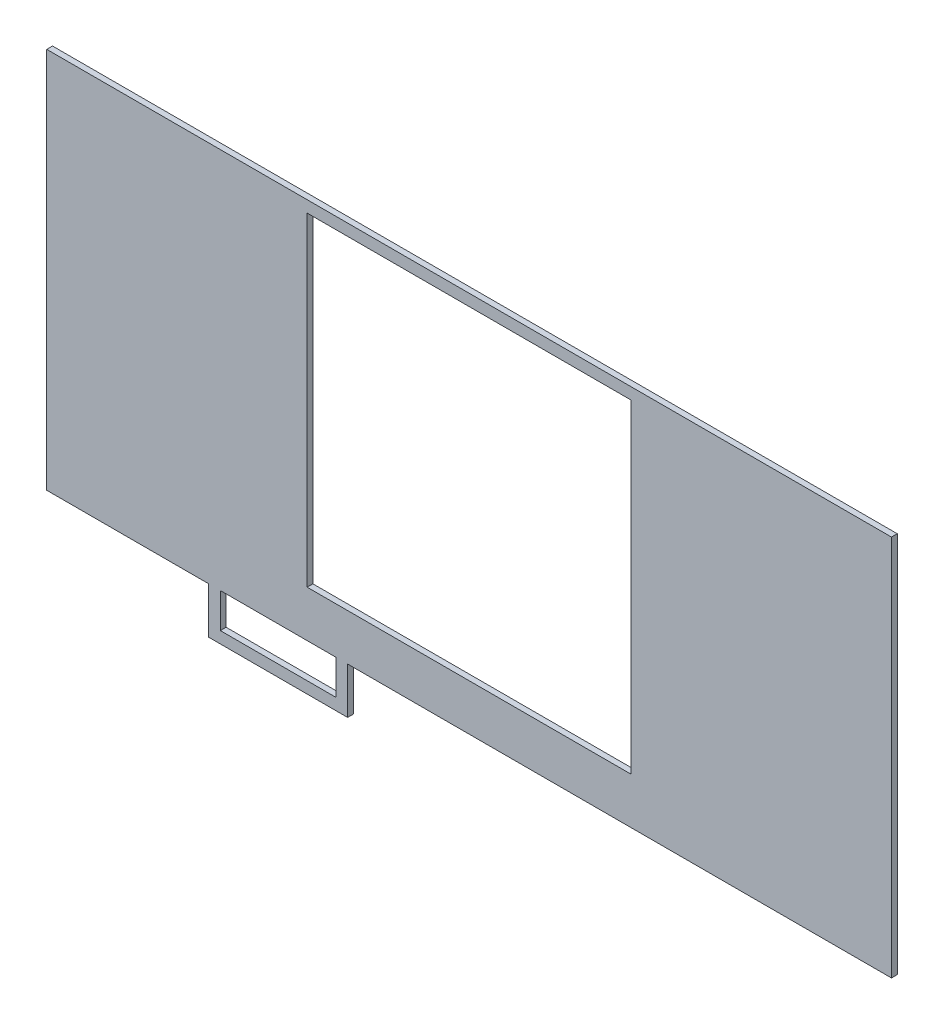
ISO-10303-21;
HEADER;
FILE_DESCRIPTION(('STEP AP214'),'2;1');
FILE_NAME('part.step','',(''),(''),'','','');
FILE_SCHEMA(('AUTOMOTIVE_DESIGN { 1 0 10303 214 1 1 1 1 }'));
ENDSEC;
DATA;
#1=APPLICATION_CONTEXT('core data for automotive mechanical design processes');
#2=APPLICATION_PROTOCOL_DEFINITION('international standard','automotive_design',2000,#1);
#3=PRODUCT_CONTEXT('',#1,'mechanical');
#4=PRODUCT('Part','Part','',(#3));
#5=PRODUCT_RELATED_PRODUCT_CATEGORY('part','',(#4));
#6=PRODUCT_DEFINITION_FORMATION('','',#4);
#7=PRODUCT_DEFINITION_CONTEXT('part definition',#1,'design');
#8=PRODUCT_DEFINITION('design','',#6,#7);
#9=PRODUCT_DEFINITION_SHAPE('','',#8);
#10=(LENGTH_UNIT() NAMED_UNIT(*) SI_UNIT(.MILLI.,.METRE.));
#11=(NAMED_UNIT(*) PLANE_ANGLE_UNIT() SI_UNIT($,.RADIAN.));
#12=(NAMED_UNIT(*) SI_UNIT($,.STERADIAN.) SOLID_ANGLE_UNIT());
#13=UNCERTAINTY_MEASURE_WITH_UNIT(LENGTH_MEASURE(1.E-05),#10,'distance_accuracy_value','');
#14=(GEOMETRIC_REPRESENTATION_CONTEXT(3) GLOBAL_UNCERTAINTY_ASSIGNED_CONTEXT((#13)) GLOBAL_UNIT_ASSIGNED_CONTEXT((#10,
#11,#12)) REPRESENTATION_CONTEXT('',''));
#15=CARTESIAN_POINT('',(0.,0.,0.));
#16=DIRECTION('',(0.,0.,1.));
#17=DIRECTION('',(1.,0.,0.));
#18=AXIS2_PLACEMENT_3D('',#15,#16,#17);
#19=CARTESIAN_POINT('',(-365.,-165.,5.));
#20=DIRECTION('',(0.,1.,0.));
#21=DIRECTION('',(0.,0.,1.));
#22=AXIS2_PLACEMENT_3D('',#19,#20,#21);
#23=PLANE('',#22);
#24=DIRECTION('',(1.,0.,0.));
#25=VECTOR('',#24,1.);
#26=CARTESIAN_POINT('',(-365.,-165.,0.));
#27=LINE('',#26,#25);
#28=CARTESIAN_POINT('',(-215.,-165.,0.));
#29=VERTEX_POINT('',#28);
#30=CARTESIAN_POINT('',(-115.,-165.,0.));
#31=VERTEX_POINT('',#30);
#32=EDGE_CURVE('E258',#29,#31,#27,.T.);
#33=ORIENTED_EDGE('',*,*,#32,.T.);
#34=DIRECTION('',(0.,0.,1.));
#35=VECTOR('',#34,1.);
#36=CARTESIAN_POINT('',(-115.,-165.,-126.491106406735));
#37=LINE('',#36,#35);
#38=CARTESIAN_POINT('',(-115.,-165.,5.));
#39=VERTEX_POINT('',#38);
#40=EDGE_CURVE('E58',#31,#39,#37,.T.);
#41=ORIENTED_EDGE('',*,*,#40,.T.);
#42=DIRECTION('',(1.,0.,0.));
#43=VECTOR('',#42,1.);
#44=CARTESIAN_POINT('',(-365.,-165.,5.));
#45=LINE('',#44,#43);
#46=CARTESIAN_POINT('',(-215.,-165.,5.));
#47=VERTEX_POINT('',#46);
#48=EDGE_CURVE('E249',#47,#39,#45,.T.);
#49=ORIENTED_EDGE('',*,*,#48,.F.);
#50=DIRECTION('',(0.,0.,1.));
#51=VECTOR('',#50,1.);
#52=CARTESIAN_POINT('',(-215.,-165.,-126.491106406735));
#53=LINE('',#52,#51);
#54=EDGE_CURVE('E199',#29,#47,#53,.T.);
#55=ORIENTED_EDGE('',*,*,#54,.F.);
#56=EDGE_LOOP('',(#33,#41,#49,#55));
#57=FACE_BOUND('',#56,.T.);
#58=ADVANCED_FACE('F35',(#57),#23,.F.);
#59=DIRECTION('',(0.,0.,1.));
#60=VECTOR('',#59,1.);
#61=CARTESIAN_POINT('',(-105.,-165.,-126.491106406735));
#62=LINE('',#61,#60);
#63=CARTESIAN_POINT('',(-105.,-165.,0.));
#64=VERTEX_POINT('',#63);
#65=CARTESIAN_POINT('',(-105.,-165.,5.));
#66=VERTEX_POINT('',#65);
#67=EDGE_CURVE('E192',#64,#66,#62,.T.);
#68=ORIENTED_EDGE('',*,*,#67,.F.);
#69=CARTESIAN_POINT('',(365.,-165.,0.));
#70=VERTEX_POINT('',#69);
#71=EDGE_CURVE('E256',#64,#70,#27,.T.);
#72=ORIENTED_EDGE('',*,*,#71,.T.);
#73=DIRECTION('',(0.,0.,-1.));
#74=VECTOR('',#73,1.);
#75=CARTESIAN_POINT('',(365.,-165.,5.));
#76=LINE('',#75,#74);
#77=CARTESIAN_POINT('',(365.,-165.,5.));
#78=VERTEX_POINT('',#77);
#79=EDGE_CURVE('E248',#78,#70,#76,.T.);
#80=ORIENTED_EDGE('',*,*,#79,.F.);
#81=EDGE_CURVE('E50',#66,#78,#45,.T.);
#82=ORIENTED_EDGE('',*,*,#81,.F.);
#83=EDGE_LOOP('',(#68,#72,#80,#82));
#84=FACE_BOUND('',#83,.T.);
#85=ADVANCED_FACE('F301',(#84),#23,.F.);
#86=CARTESIAN_POINT('',(365.,-165.,5.));
#87=DIRECTION('',(-1.,0.,0.));
#88=DIRECTION('',(0.,0.,1.));
#89=AXIS2_PLACEMENT_3D('',#86,#87,#88);
#90=PLANE('',#89);
#91=DIRECTION('',(0.,1.,0.));
#92=VECTOR('',#91,1.);
#93=CARTESIAN_POINT('',(365.,-165.,0.));
#94=LINE('',#93,#92);
#95=CARTESIAN_POINT('',(365.,165.,0.));
#96=VERTEX_POINT('',#95);
#97=EDGE_CURVE('E236',#70,#96,#94,.T.);
#98=ORIENTED_EDGE('',*,*,#97,.T.);
#99=DIRECTION('',(0.,0.,-1.));
#100=VECTOR('',#99,1.);
#101=CARTESIAN_POINT('',(365.,165.,5.));
#102=LINE('',#101,#100);
#103=CARTESIAN_POINT('',(365.,165.,5.));
#104=VERTEX_POINT('',#103);
#105=EDGE_CURVE('E11',#104,#96,#102,.T.);
#106=ORIENTED_EDGE('',*,*,#105,.F.);
#107=DIRECTION('',(0.,1.,0.));
#108=VECTOR('',#107,1.);
#109=CARTESIAN_POINT('',(365.,-165.,5.));
#110=LINE('',#109,#108);
#111=EDGE_CURVE('E237',#78,#104,#110,.T.);
#112=ORIENTED_EDGE('',*,*,#111,.F.);
#113=ORIENTED_EDGE('',*,*,#79,.T.);
#114=EDGE_LOOP('',(#98,#106,#112,#113));
#115=FACE_BOUND('',#114,.T.);
#116=ADVANCED_FACE('F37',(#115),#90,.F.);
#117=CARTESIAN_POINT('',(-365.,165.,5.));
#118=DIRECTION('',(0.,-1.,0.));
#119=DIRECTION('',(0.,0.,-1.));
#120=AXIS2_PLACEMENT_3D('',#117,#118,#119);
#121=PLANE('',#120);
#122=DIRECTION('',(-1.,0.,0.));
#123=VECTOR('',#122,1.);
#124=CARTESIAN_POINT('',(-365.,165.,0.));
#125=LINE('',#124,#123);
#126=CARTESIAN_POINT('',(-365.,165.,0.));
#127=VERTEX_POINT('',#126);
#128=EDGE_CURVE('E252',#96,#127,#125,.T.);
#129=ORIENTED_EDGE('',*,*,#128,.T.);
#130=DIRECTION('',(0.,0.,-1.));
#131=VECTOR('',#130,1.);
#132=CARTESIAN_POINT('',(-365.,165.,5.));
#133=LINE('',#132,#131);
#134=CARTESIAN_POINT('',(-365.,165.,5.));
#135=VERTEX_POINT('',#134);
#136=EDGE_CURVE('E43',#135,#127,#133,.T.);
#137=ORIENTED_EDGE('',*,*,#136,.F.);
#138=DIRECTION('',(-1.,0.,0.));
#139=VECTOR('',#138,1.);
#140=CARTESIAN_POINT('',(-365.,165.,5.));
#141=LINE('',#140,#139);
#142=EDGE_CURVE('E240',#104,#135,#141,.T.);
#143=ORIENTED_EDGE('',*,*,#142,.F.);
#144=ORIENTED_EDGE('',*,*,#105,.T.);
#145=EDGE_LOOP('',(#129,#137,#143,#144));
#146=FACE_BOUND('',#145,.T.);
#147=ADVANCED_FACE('F303',(#146),#121,.F.);
#148=CARTESIAN_POINT('',(-365.,-165.,5.));
#149=DIRECTION('',(1.,0.,0.));
#150=DIRECTION('',(0.,0.,-1.));
#151=AXIS2_PLACEMENT_3D('',#148,#149,#150);
#152=PLANE('',#151);
#153=DIRECTION('',(0.,-1.,0.));
#154=VECTOR('',#153,1.);
#155=CARTESIAN_POINT('',(-365.,-165.,0.));
#156=LINE('',#155,#154);
#157=CARTESIAN_POINT('',(-365.,-165.,0.));
#158=VERTEX_POINT('',#157);
#159=EDGE_CURVE('E254',#127,#158,#156,.T.);
#160=ORIENTED_EDGE('',*,*,#159,.T.);
#161=DIRECTION('',(0.,0.,-1.));
#162=VECTOR('',#161,1.);
#163=CARTESIAN_POINT('',(-365.,-165.,5.));
#164=LINE('',#163,#162);
#165=CARTESIAN_POINT('',(-365.,-165.,5.));
#166=VERTEX_POINT('',#165);
#167=EDGE_CURVE('E261',#166,#158,#164,.T.);
#168=ORIENTED_EDGE('',*,*,#167,.F.);
#169=DIRECTION('',(0.,-1.,0.));
#170=VECTOR('',#169,1.);
#171=CARTESIAN_POINT('',(-365.,-165.,5.));
#172=LINE('',#171,#170);
#173=EDGE_CURVE('E243',#135,#166,#172,.T.);
#174=ORIENTED_EDGE('',*,*,#173,.F.);
#175=ORIENTED_EDGE('',*,*,#136,.T.);
#176=EDGE_LOOP('',(#160,#168,#174,#175));
#177=FACE_BOUND('',#176,.T.);
#178=ADVANCED_FACE('F268',(#177),#152,.F.);
#179=CARTESIAN_POINT('',(-225.,-165.,0.));
#180=VERTEX_POINT('',#179);
#181=EDGE_CURVE('E241',#158,#180,#27,.T.);
#182=ORIENTED_EDGE('',*,*,#181,.T.);
#183=DIRECTION('',(0.,0.,1.));
#184=VECTOR('',#183,1.);
#185=CARTESIAN_POINT('',(-225.,-165.,-126.491106406735));
#186=LINE('',#185,#184);
#187=CARTESIAN_POINT('',(-225.,-165.,5.));
#188=VERTEX_POINT('',#187);
#189=EDGE_CURVE('E190',#180,#188,#186,.T.);
#190=ORIENTED_EDGE('',*,*,#189,.T.);
#191=EDGE_CURVE('E245',#166,#188,#45,.T.);
#192=ORIENTED_EDGE('',*,*,#191,.F.);
#193=ORIENTED_EDGE('',*,*,#167,.T.);
#194=EDGE_LOOP('',(#182,#190,#192,#193));
#195=FACE_BOUND('',#194,.T.);
#196=ADVANCED_FACE('F277',(#195),#23,.F.);
#197=CARTESIAN_POINT('',(0.,0.,5.));
#198=DIRECTION('',(0.,0.,-1.));
#199=DIRECTION('',(-1.,0.,0.));
#200=AXIS2_PLACEMENT_3D('',#197,#198,#199);
#201=PLANE('',#200);
#202=DIRECTION('',(0.,-1.,0.));
#203=VECTOR('',#202,1.);
#204=CARTESIAN_POINT('',(-215.,-1.98914958578674E-13,5.));
#205=LINE('',#204,#203);
#206=CARTESIAN_POINT('',(-215.,-195.,5.));
#207=VERTEX_POINT('',#206);
#208=EDGE_CURVE('E198',#47,#207,#205,.T.);
#209=ORIENTED_EDGE('',*,*,#208,.F.);
#210=ORIENTED_EDGE('',*,*,#48,.T.);
#211=DIRECTION('',(0.,-1.,0.));
#212=VECTOR('',#211,1.);
#213=CARTESIAN_POINT('',(-115.,-1.06396373193244E-13,5.));
#214=LINE('',#213,#212);
#215=CARTESIAN_POINT('',(-115.,-195.,5.));
#216=VERTEX_POINT('',#215);
#217=EDGE_CURVE('E159',#39,#216,#214,.T.);
#218=ORIENTED_EDGE('',*,*,#217,.T.);
#219=DIRECTION('',(1.,0.,0.));
#220=VECTOR('',#219,1.);
#221=CARTESIAN_POINT('',(0.,-195.,5.));
#222=LINE('',#221,#220);
#223=EDGE_CURVE('E165',#207,#216,#222,.T.);
#224=ORIENTED_EDGE('',*,*,#223,.F.);
#225=EDGE_LOOP('',(#209,#210,#218,#224));
#226=FACE_BOUND('',#225,.T.);
#227=DIRECTION('',(0.,-1.,0.));
#228=VECTOR('',#227,1.);
#229=CARTESIAN_POINT('',(-140.,155.,5.));
#230=LINE('',#229,#228);
#231=CARTESIAN_POINT('',(-140.,155.,5.));
#232=VERTEX_POINT('',#231);
#233=CARTESIAN_POINT('',(-140.,-125.,5.));
#234=VERTEX_POINT('',#233);
#235=EDGE_CURVE('E208',#232,#234,#230,.T.);
#236=ORIENTED_EDGE('',*,*,#235,.F.);
#237=DIRECTION('',(-1.,0.,0.));
#238=VECTOR('',#237,1.);
#239=CARTESIAN_POINT('',(140.,155.,5.));
#240=LINE('',#239,#238);
#241=CARTESIAN_POINT('',(140.,155.,5.));
#242=VERTEX_POINT('',#241);
#243=EDGE_CURVE('E211',#242,#232,#240,.T.);
#244=ORIENTED_EDGE('',*,*,#243,.F.);
#245=DIRECTION('',(0.,1.,0.));
#246=VECTOR('',#245,1.);
#247=CARTESIAN_POINT('',(140.,155.,5.));
#248=LINE('',#247,#246);
#249=CARTESIAN_POINT('',(140.,-125.,5.));
#250=VERTEX_POINT('',#249);
#251=EDGE_CURVE('E204',#250,#242,#248,.T.);
#252=ORIENTED_EDGE('',*,*,#251,.F.);
#253=DIRECTION('',(1.,0.,0.));
#254=VECTOR('',#253,1.);
#255=CARTESIAN_POINT('',(140.,-125.,5.));
#256=LINE('',#255,#254);
#257=EDGE_CURVE('E205',#234,#250,#256,.T.);
#258=ORIENTED_EDGE('',*,*,#257,.F.);
#259=EDGE_LOOP('',(#236,#244,#252,#258));
#260=FACE_BOUND('',#259,.T.);
#261=ORIENTED_EDGE('',*,*,#111,.T.);
#262=ORIENTED_EDGE('',*,*,#142,.T.);
#263=ORIENTED_EDGE('',*,*,#173,.T.);
#264=ORIENTED_EDGE('',*,*,#191,.T.);
#265=DIRECTION('',(0.,-1.,0.));
#266=VECTOR('',#265,1.);
#267=CARTESIAN_POINT('',(-225.,-1.56125112837913E-13,5.));
#268=LINE('',#267,#266);
#269=CARTESIAN_POINT('',(-225.,-205.,5.));
#270=VERTEX_POINT('',#269);
#271=EDGE_CURVE('E175',#188,#270,#268,.T.);
#272=ORIENTED_EDGE('',*,*,#271,.T.);
#273=DIRECTION('',(1.,0.,0.));
#274=VECTOR('',#273,1.);
#275=CARTESIAN_POINT('',(0.,-205.,5.));
#276=LINE('',#275,#274);
#277=CARTESIAN_POINT('',(-105.,-205.,5.));
#278=VERTEX_POINT('',#277);
#279=EDGE_CURVE('E172',#270,#278,#276,.T.);
#280=ORIENTED_EDGE('',*,*,#279,.T.);
#281=DIRECTION('',(0.,-1.,0.));
#282=VECTOR('',#281,1.);
#283=CARTESIAN_POINT('',(-105.,0.,5.));
#284=LINE('',#283,#282);
#285=EDGE_CURVE('E194',#66,#278,#284,.T.);
#286=ORIENTED_EDGE('',*,*,#285,.F.);
#287=ORIENTED_EDGE('',*,*,#81,.T.);
#288=EDGE_LOOP('',(#261,#262,#263,#264,#272,#280,#286,#287));
#289=FACE_BOUND('',#288,.T.);
#290=ADVANCED_FACE('F282',(#226,#260,#289),#201,.F.);
#291=CARTESIAN_POINT('',(0.,0.,0.));
#292=DIRECTION('',(0.,0.,-1.));
#293=DIRECTION('',(-1.,0.,0.));
#294=AXIS2_PLACEMENT_3D('',#291,#292,#293);
#295=PLANE('',#294);
#296=ORIENTED_EDGE('',*,*,#32,.F.);
#297=DIRECTION('',(0.,-1.,0.));
#298=VECTOR('',#297,1.);
#299=CARTESIAN_POINT('',(-215.,-1.98914958578674E-13,0.));
#300=LINE('',#299,#298);
#301=CARTESIAN_POINT('',(-215.,-195.,0.));
#302=VERTEX_POINT('',#301);
#303=EDGE_CURVE('E156',#29,#302,#300,.T.);
#304=ORIENTED_EDGE('',*,*,#303,.T.);
#305=DIRECTION('',(1.,0.,0.));
#306=VECTOR('',#305,1.);
#307=CARTESIAN_POINT('',(0.,-195.,0.));
#308=LINE('',#307,#306);
#309=CARTESIAN_POINT('',(-115.,-195.,0.));
#310=VERTEX_POINT('',#309);
#311=EDGE_CURVE('E149',#302,#310,#308,.T.);
#312=ORIENTED_EDGE('',*,*,#311,.T.);
#313=DIRECTION('',(0.,-1.,0.));
#314=VECTOR('',#313,1.);
#315=CARTESIAN_POINT('',(-115.,-1.06396373193244E-13,0.));
#316=LINE('',#315,#314);
#317=EDGE_CURVE('E154',#31,#310,#316,.T.);
#318=ORIENTED_EDGE('',*,*,#317,.F.);
#319=EDGE_LOOP('',(#296,#304,#312,#318));
#320=FACE_BOUND('',#319,.T.);
#321=DIRECTION('',(-1.,0.,0.));
#322=VECTOR('',#321,1.);
#323=CARTESIAN_POINT('',(140.,155.,0.));
#324=LINE('',#323,#322);
#325=CARTESIAN_POINT('',(140.,155.,0.));
#326=VERTEX_POINT('',#325);
#327=CARTESIAN_POINT('',(-140.,155.,0.));
#328=VERTEX_POINT('',#327);
#329=EDGE_CURVE('E207',#326,#328,#324,.T.);
#330=ORIENTED_EDGE('',*,*,#329,.T.);
#331=DIRECTION('',(0.,-1.,0.));
#332=VECTOR('',#331,1.);
#333=CARTESIAN_POINT('',(-140.,155.,0.));
#334=LINE('',#333,#332);
#335=CARTESIAN_POINT('',(-140.,-125.,0.));
#336=VERTEX_POINT('',#335);
#337=EDGE_CURVE('E228',#328,#336,#334,.T.);
#338=ORIENTED_EDGE('',*,*,#337,.T.);
#339=DIRECTION('',(1.,0.,0.));
#340=VECTOR('',#339,1.);
#341=CARTESIAN_POINT('',(140.,-125.,0.));
#342=LINE('',#341,#340);
#343=CARTESIAN_POINT('',(140.,-125.,0.));
#344=VERTEX_POINT('',#343);
#345=EDGE_CURVE('E224',#336,#344,#342,.T.);
#346=ORIENTED_EDGE('',*,*,#345,.T.);
#347=DIRECTION('',(0.,1.,0.));
#348=VECTOR('',#347,1.);
#349=CARTESIAN_POINT('',(140.,155.,0.));
#350=LINE('',#349,#348);
#351=EDGE_CURVE('E219',#344,#326,#350,.T.);
#352=ORIENTED_EDGE('',*,*,#351,.T.);
#353=EDGE_LOOP('',(#330,#338,#346,#352));
#354=FACE_BOUND('',#353,.T.);
#355=ORIENTED_EDGE('',*,*,#97,.F.);
#356=ORIENTED_EDGE('',*,*,#71,.F.);
#357=DIRECTION('',(0.,-1.,0.));
#358=VECTOR('',#357,1.);
#359=CARTESIAN_POINT('',(-105.,0.,0.));
#360=LINE('',#359,#358);
#361=CARTESIAN_POINT('',(-105.,-205.,0.));
#362=VERTEX_POINT('',#361);
#363=EDGE_CURVE('E180',#64,#362,#360,.T.);
#364=ORIENTED_EDGE('',*,*,#363,.T.);
#365=DIRECTION('',(1.,0.,0.));
#366=VECTOR('',#365,1.);
#367=CARTESIAN_POINT('',(0.,-205.,0.));
#368=LINE('',#367,#366);
#369=CARTESIAN_POINT('',(-225.,-205.,0.));
#370=VERTEX_POINT('',#369);
#371=EDGE_CURVE('E182',#370,#362,#368,.T.);
#372=ORIENTED_EDGE('',*,*,#371,.F.);
#373=DIRECTION('',(0.,-1.,0.));
#374=VECTOR('',#373,1.);
#375=CARTESIAN_POINT('',(-225.,-1.56125112837913E-13,0.));
#376=LINE('',#375,#374);
#377=EDGE_CURVE('E187',#180,#370,#376,.T.);
#378=ORIENTED_EDGE('',*,*,#377,.F.);
#379=ORIENTED_EDGE('',*,*,#181,.F.);
#380=ORIENTED_EDGE('',*,*,#159,.F.);
#381=ORIENTED_EDGE('',*,*,#128,.F.);
#382=EDGE_LOOP('',(#355,#356,#364,#372,#378,#379,#380,#381));
#383=FACE_BOUND('',#382,.T.);
#384=ADVANCED_FACE('F151',(#320,#354,#383),#295,.T.);
#385=CARTESIAN_POINT('',(140.,155.,-395.979797464467));
#386=DIRECTION('',(0.,1.,0.));
#387=DIRECTION('',(-1.,0.,0.));
#388=AXIS2_PLACEMENT_3D('',#385,#386,#387);
#389=PLANE('',#388);
#390=DIRECTION('',(0.,0.,1.));
#391=VECTOR('',#390,1.);
#392=CARTESIAN_POINT('',(140.,155.,-395.979797464467));
#393=LINE('',#392,#391);
#394=EDGE_CURVE('E222',#326,#242,#393,.T.);
#395=ORIENTED_EDGE('',*,*,#394,.T.);
#396=ORIENTED_EDGE('',*,*,#243,.T.);
#397=DIRECTION('',(0.,0.,1.));
#398=VECTOR('',#397,1.);
#399=CARTESIAN_POINT('',(-140.,155.,-395.979797464467));
#400=LINE('',#399,#398);
#401=EDGE_CURVE('E218',#328,#232,#400,.T.);
#402=ORIENTED_EDGE('',*,*,#401,.F.);
#403=ORIENTED_EDGE('',*,*,#329,.F.);
#404=EDGE_LOOP('',(#395,#396,#402,#403));
#405=FACE_BOUND('',#404,.T.);
#406=ADVANCED_FACE('F324',(#405),#389,.F.);
#407=CARTESIAN_POINT('',(-140.,155.,-395.979797464467));
#408=DIRECTION('',(-1.,0.,0.));
#409=DIRECTION('',(0.,0.,1.));
#410=AXIS2_PLACEMENT_3D('',#407,#408,#409);
#411=PLANE('',#410);
#412=ORIENTED_EDGE('',*,*,#401,.T.);
#413=ORIENTED_EDGE('',*,*,#235,.T.);
#414=DIRECTION('',(0.,0.,1.));
#415=VECTOR('',#414,1.);
#416=CARTESIAN_POINT('',(-140.,-125.,-395.979797464467));
#417=LINE('',#416,#415);
#418=EDGE_CURVE('E227',#336,#234,#417,.T.);
#419=ORIENTED_EDGE('',*,*,#418,.F.);
#420=ORIENTED_EDGE('',*,*,#337,.F.);
#421=EDGE_LOOP('',(#412,#413,#419,#420));
#422=FACE_BOUND('',#421,.T.);
#423=ADVANCED_FACE('F328',(#422),#411,.F.);
#424=CARTESIAN_POINT('',(140.,-125.,-395.979797464467));
#425=DIRECTION('',(0.,-1.,0.));
#426=DIRECTION('',(1.,0.,0.));
#427=AXIS2_PLACEMENT_3D('',#424,#425,#426);
#428=PLANE('',#427);
#429=ORIENTED_EDGE('',*,*,#418,.T.);
#430=ORIENTED_EDGE('',*,*,#257,.T.);
#431=DIRECTION('',(0.,0.,1.));
#432=VECTOR('',#431,1.);
#433=CARTESIAN_POINT('',(140.,-125.,-395.979797464467));
#434=LINE('',#433,#432);
#435=EDGE_CURVE('E223',#344,#250,#434,.T.);
#436=ORIENTED_EDGE('',*,*,#435,.F.);
#437=ORIENTED_EDGE('',*,*,#345,.F.);
#438=EDGE_LOOP('',(#429,#430,#436,#437));
#439=FACE_BOUND('',#438,.T.);
#440=ADVANCED_FACE('F332',(#439),#428,.F.);
#441=CARTESIAN_POINT('',(140.,155.,-395.979797464467));
#442=DIRECTION('',(1.,0.,0.));
#443=DIRECTION('',(0.,1.,0.));
#444=AXIS2_PLACEMENT_3D('',#441,#442,#443);
#445=PLANE('',#444);
#446=ORIENTED_EDGE('',*,*,#435,.T.);
#447=ORIENTED_EDGE('',*,*,#251,.T.);
#448=ORIENTED_EDGE('',*,*,#394,.F.);
#449=ORIENTED_EDGE('',*,*,#351,.F.);
#450=EDGE_LOOP('',(#446,#447,#448,#449));
#451=FACE_BOUND('',#450,.T.);
#452=ADVANCED_FACE('F336',(#451),#445,.F.);
#453=CARTESIAN_POINT('',(-115.,-1.06396373193244E-13,-126.491106406735));
#454=DIRECTION('',(-1.,0.,0.));
#455=DIRECTION('',(0.,-1.,0.));
#456=AXIS2_PLACEMENT_3D('',#453,#454,#455);
#457=PLANE('',#456);
#458=ORIENTED_EDGE('',*,*,#40,.F.);
#459=ORIENTED_EDGE('',*,*,#317,.T.);
#460=DIRECTION('',(0.,0.,1.));
#461=VECTOR('',#460,1.);
#462=CARTESIAN_POINT('',(-115.,-195.,-126.491106406735));
#463=LINE('',#462,#461);
#464=EDGE_CURVE('E162',#310,#216,#463,.T.);
#465=ORIENTED_EDGE('',*,*,#464,.T.);
#466=ORIENTED_EDGE('',*,*,#217,.F.);
#467=EDGE_LOOP('',(#458,#459,#465,#466));
#468=FACE_BOUND('',#467,.T.);
#469=ADVANCED_FACE('F171',(#468),#457,.T.);
#470=CARTESIAN_POINT('',(0.,-195.,-126.491106406735));
#471=DIRECTION('',(0.,-1.,0.));
#472=DIRECTION('',(0.,0.,-1.));
#473=AXIS2_PLACEMENT_3D('',#470,#471,#472);
#474=PLANE('',#473);
#475=ORIENTED_EDGE('',*,*,#311,.F.);
#476=DIRECTION('',(0.,0.,1.));
#477=VECTOR('',#476,1.);
#478=CARTESIAN_POINT('',(-215.,-195.,-126.491106406735));
#479=LINE('',#478,#477);
#480=EDGE_CURVE('E169',#302,#207,#479,.T.);
#481=ORIENTED_EDGE('',*,*,#480,.T.);
#482=ORIENTED_EDGE('',*,*,#223,.T.);
#483=ORIENTED_EDGE('',*,*,#464,.F.);
#484=EDGE_LOOP('',(#475,#481,#482,#483));
#485=FACE_BOUND('',#484,.T.);
#486=ADVANCED_FACE('F163',(#485),#474,.F.);
#487=CARTESIAN_POINT('',(-215.,-1.98914958578674E-13,-126.491106406735));
#488=DIRECTION('',(-1.,0.,0.));
#489=DIRECTION('',(0.,-1.,0.));
#490=AXIS2_PLACEMENT_3D('',#487,#488,#489);
#491=PLANE('',#490);
#492=ORIENTED_EDGE('',*,*,#303,.F.);
#493=ORIENTED_EDGE('',*,*,#54,.T.);
#494=ORIENTED_EDGE('',*,*,#208,.T.);
#495=ORIENTED_EDGE('',*,*,#480,.F.);
#496=EDGE_LOOP('',(#492,#493,#494,#495));
#497=FACE_BOUND('',#496,.T.);
#498=ADVANCED_FACE('F293',(#497),#491,.F.);
#499=CARTESIAN_POINT('',(-225.,-1.56125112837913E-13,-126.491106406735));
#500=DIRECTION('',(-1.,0.,0.));
#501=DIRECTION('',(0.,-1.,0.));
#502=AXIS2_PLACEMENT_3D('',#499,#500,#501);
#503=PLANE('',#502);
#504=ORIENTED_EDGE('',*,*,#189,.F.);
#505=ORIENTED_EDGE('',*,*,#377,.T.);
#506=DIRECTION('',(0.,0.,1.));
#507=VECTOR('',#506,1.);
#508=CARTESIAN_POINT('',(-225.,-205.,-126.491106406735));
#509=LINE('',#508,#507);
#510=EDGE_CURVE('E186',#370,#270,#509,.T.);
#511=ORIENTED_EDGE('',*,*,#510,.T.);
#512=ORIENTED_EDGE('',*,*,#271,.F.);
#513=EDGE_LOOP('',(#504,#505,#511,#512));
#514=FACE_BOUND('',#513,.T.);
#515=ADVANCED_FACE('F284',(#514),#503,.T.);
#516=CARTESIAN_POINT('',(0.,-205.,-126.491106406735));
#517=DIRECTION('',(0.,-1.,0.));
#518=DIRECTION('',(0.,0.,-1.));
#519=AXIS2_PLACEMENT_3D('',#516,#517,#518);
#520=PLANE('',#519);
#521=ORIENTED_EDGE('',*,*,#510,.F.);
#522=ORIENTED_EDGE('',*,*,#371,.T.);
#523=DIRECTION('',(0.,0.,1.));
#524=VECTOR('',#523,1.);
#525=CARTESIAN_POINT('',(-105.,-205.,-126.491106406735));
#526=LINE('',#525,#524);
#527=EDGE_CURVE('E185',#362,#278,#526,.T.);
#528=ORIENTED_EDGE('',*,*,#527,.T.);
#529=ORIENTED_EDGE('',*,*,#279,.F.);
#530=EDGE_LOOP('',(#521,#522,#528,#529));
#531=FACE_BOUND('',#530,.T.);
#532=ADVANCED_FACE('F349',(#531),#520,.T.);
#533=CARTESIAN_POINT('',(-105.,0.,-126.491106406735));
#534=DIRECTION('',(-1.,0.,0.));
#535=DIRECTION('',(0.,-1.,0.));
#536=AXIS2_PLACEMENT_3D('',#533,#534,#535);
#537=PLANE('',#536);
#538=ORIENTED_EDGE('',*,*,#363,.F.);
#539=ORIENTED_EDGE('',*,*,#67,.T.);
#540=ORIENTED_EDGE('',*,*,#285,.T.);
#541=ORIENTED_EDGE('',*,*,#527,.F.);
#542=EDGE_LOOP('',(#538,#539,#540,#541));
#543=FACE_BOUND('',#542,.T.);
#544=ADVANCED_FACE('F352',(#543),#537,.F.);
#545=CLOSED_SHELL('',(#58,#85,#116,#147,#178,#196,#290,#384,#406,#423,#440,#452,#469,#486,#498,
#515,#532,#544));
#546=MANIFOLD_SOLID_BREP('B2',#545);
#547=ADVANCED_BREP_SHAPE_REPRESENTATION('',(#18,#546),#14);
#548=SHAPE_DEFINITION_REPRESENTATION(#9,#547);
ENDSEC;
END-ISO-10303-21;
